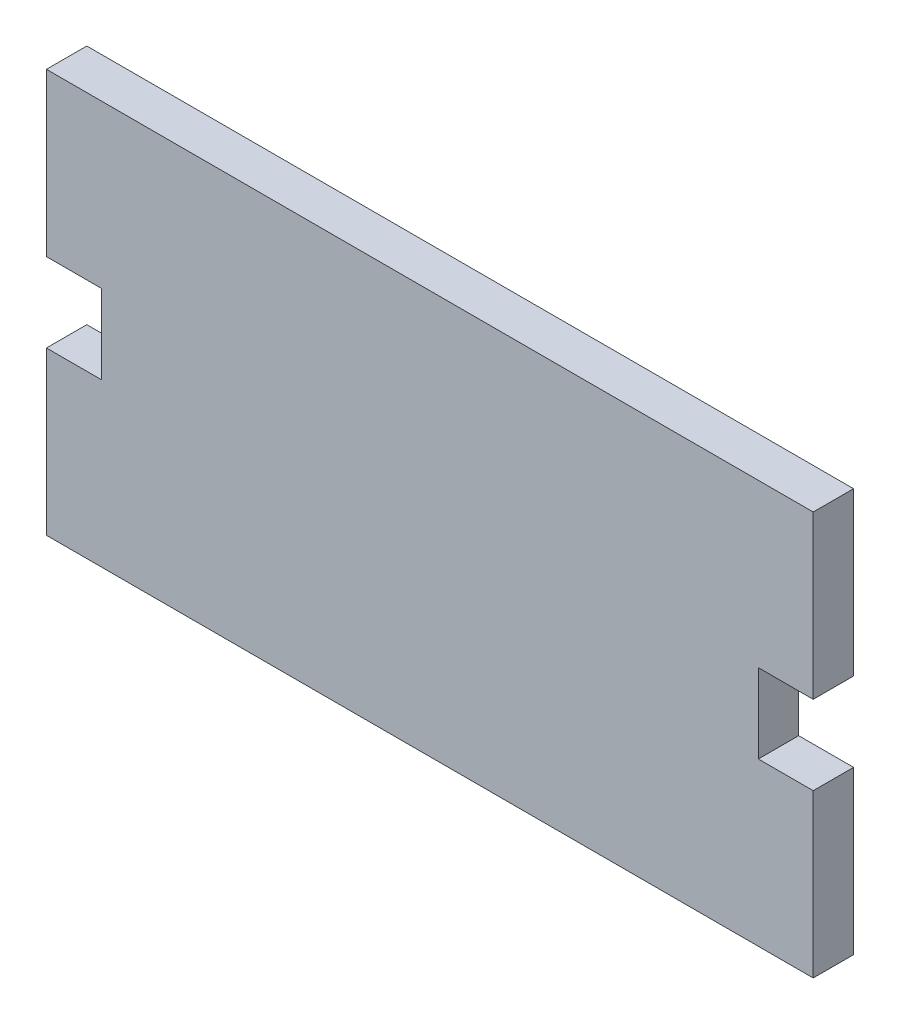
ISO-10303-21;
HEADER;
FILE_DESCRIPTION(('STEP AP214'),'2;1');
FILE_NAME('part.step','',(''),(''),'','','');
FILE_SCHEMA(('AUTOMOTIVE_DESIGN { 1 0 10303 214 1 1 1 1 }'));
ENDSEC;
DATA;
#1=APPLICATION_CONTEXT('core data for automotive mechanical design processes');
#2=APPLICATION_PROTOCOL_DEFINITION('international standard','automotive_design',2000,#1);
#3=PRODUCT_CONTEXT('',#1,'mechanical');
#4=PRODUCT('Part','Part','',(#3));
#5=PRODUCT_RELATED_PRODUCT_CATEGORY('part','',(#4));
#6=PRODUCT_DEFINITION_FORMATION('','',#4);
#7=PRODUCT_DEFINITION_CONTEXT('part definition',#1,'design');
#8=PRODUCT_DEFINITION('design','',#6,#7);
#9=PRODUCT_DEFINITION_SHAPE('','',#8);
#10=(LENGTH_UNIT() NAMED_UNIT(*) SI_UNIT(.MILLI.,.METRE.));
#11=(NAMED_UNIT(*) PLANE_ANGLE_UNIT() SI_UNIT($,.RADIAN.));
#12=(NAMED_UNIT(*) SI_UNIT($,.STERADIAN.) SOLID_ANGLE_UNIT());
#13=UNCERTAINTY_MEASURE_WITH_UNIT(LENGTH_MEASURE(1.E-05),#10,'distance_accuracy_value','');
#14=(GEOMETRIC_REPRESENTATION_CONTEXT(3) GLOBAL_UNCERTAINTY_ASSIGNED_CONTEXT((#13)) GLOBAL_UNIT_ASSIGNED_CONTEXT((#10,
#11,#12)) REPRESENTATION_CONTEXT('',''));
#15=CARTESIAN_POINT('',(0.,0.,0.));
#16=DIRECTION('',(0.,0.,1.));
#17=DIRECTION('',(1.,0.,0.));
#18=AXIS2_PLACEMENT_3D('',#15,#16,#17);
#19=CARTESIAN_POINT('',(0.,0.,6.35));
#20=DIRECTION('',(1.,0.,0.));
#21=DIRECTION('',(0.,0.,-1.));
#22=AXIS2_PLACEMENT_3D('',#19,#20,#21);
#23=PLANE('',#22);
#24=DIRECTION('',(0.,-1.,0.));
#25=VECTOR('',#24,1.);
#26=CARTESIAN_POINT('',(0.,0.,0.));
#27=LINE('',#26,#25);
#28=CARTESIAN_POINT('',(0.,63.5,0.));
#29=VERTEX_POINT('',#28);
#30=CARTESIAN_POINT('',(0.,37.973,0.));
#31=VERTEX_POINT('',#30);
#32=EDGE_CURVE('E147',#29,#31,#27,.T.);
#33=ORIENTED_EDGE('',*,*,#32,.T.);
#34=DIRECTION('',(0.,0.,1.));
#35=VECTOR('',#34,1.);
#36=CARTESIAN_POINT('',(0.,37.973,0.));
#37=LINE('',#36,#35);
#38=CARTESIAN_POINT('',(0.,37.973,6.35));
#39=VERTEX_POINT('',#38);
#40=EDGE_CURVE('E148',#31,#39,#37,.T.);
#41=ORIENTED_EDGE('',*,*,#40,.T.);
#42=DIRECTION('',(0.,-1.,0.));
#43=VECTOR('',#42,1.);
#44=CARTESIAN_POINT('',(0.,0.,6.35));
#45=LINE('',#44,#43);
#46=CARTESIAN_POINT('',(0.,63.5,6.35));
#47=VERTEX_POINT('',#46);
#48=EDGE_CURVE('E197',#47,#39,#45,.T.);
#49=ORIENTED_EDGE('',*,*,#48,.F.);
#50=DIRECTION('',(0.,0.,-1.));
#51=VECTOR('',#50,1.);
#52=CARTESIAN_POINT('',(0.,63.5,6.35));
#53=LINE('',#52,#51);
#54=EDGE_CURVE('E165',#47,#29,#53,.T.);
#55=ORIENTED_EDGE('',*,*,#54,.T.);
#56=EDGE_LOOP('',(#33,#41,#49,#55));
#57=FACE_BOUND('',#56,.T.);
#58=ADVANCED_FACE('F36',(#57),#23,.F.);
#59=CARTESIAN_POINT('',(120.65,0.,6.35));
#60=DIRECTION('',(-1.,0.,0.));
#61=DIRECTION('',(0.,0.,1.));
#62=AXIS2_PLACEMENT_3D('',#59,#60,#61);
#63=PLANE('',#62);
#64=DIRECTION('',(0.,1.,0.));
#65=VECTOR('',#64,1.);
#66=CARTESIAN_POINT('',(120.65,0.,0.));
#67=LINE('',#66,#65);
#68=CARTESIAN_POINT('',(120.65,0.,0.));
#69=VERTEX_POINT('',#68);
#70=CARTESIAN_POINT('',(120.65,25.527,0.));
#71=VERTEX_POINT('',#70);
#72=EDGE_CURVE('E160',#69,#71,#67,.T.);
#73=ORIENTED_EDGE('',*,*,#72,.T.);
#74=DIRECTION('',(0.,0.,1.));
#75=VECTOR('',#74,1.);
#76=CARTESIAN_POINT('',(120.65,25.527,0.));
#77=LINE('',#76,#75);
#78=CARTESIAN_POINT('',(120.65,25.527,6.35));
#79=VERTEX_POINT('',#78);
#80=EDGE_CURVE('E237',#71,#79,#77,.T.);
#81=ORIENTED_EDGE('',*,*,#80,.T.);
#82=DIRECTION('',(0.,1.,0.));
#83=VECTOR('',#82,1.);
#84=CARTESIAN_POINT('',(120.65,0.,6.35));
#85=LINE('',#84,#83);
#86=CARTESIAN_POINT('',(120.65,0.,6.35));
#87=VERTEX_POINT('',#86);
#88=EDGE_CURVE('E177',#87,#79,#85,.T.);
#89=ORIENTED_EDGE('',*,*,#88,.F.);
#90=DIRECTION('',(0.,0.,-1.));
#91=VECTOR('',#90,1.);
#92=CARTESIAN_POINT('',(120.65,0.,6.35));
#93=LINE('',#92,#91);
#94=EDGE_CURVE('E44',#87,#69,#93,.T.);
#95=ORIENTED_EDGE('',*,*,#94,.T.);
#96=EDGE_LOOP('',(#73,#81,#89,#95));
#97=FACE_BOUND('',#96,.T.);
#98=ADVANCED_FACE('F174',(#97),#63,.F.);
#99=CARTESIAN_POINT('',(0.,25.527,6.35));
#100=VERTEX_POINT('',#99);
#101=CARTESIAN_POINT('',(0.,0.,6.35));
#102=VERTEX_POINT('',#101);
#103=EDGE_CURVE('E140',#100,#102,#45,.T.);
#104=ORIENTED_EDGE('',*,*,#103,.F.);
#105=DIRECTION('',(0.,0.,1.));
#106=VECTOR('',#105,1.);
#107=CARTESIAN_POINT('',(0.,25.527,0.));
#108=LINE('',#107,#106);
#109=CARTESIAN_POINT('',(0.,25.527,0.));
#110=VERTEX_POINT('',#109);
#111=EDGE_CURVE('E128',#110,#100,#108,.T.);
#112=ORIENTED_EDGE('',*,*,#111,.F.);
#113=CARTESIAN_POINT('',(0.,0.,0.));
#114=VERTEX_POINT('',#113);
#115=EDGE_CURVE('E138',#110,#114,#27,.T.);
#116=ORIENTED_EDGE('',*,*,#115,.T.);
#117=DIRECTION('',(0.,0.,-1.));
#118=VECTOR('',#117,1.);
#119=CARTESIAN_POINT('',(0.,0.,6.35));
#120=LINE('',#119,#118);
#121=EDGE_CURVE('E11',#102,#114,#120,.T.);
#122=ORIENTED_EDGE('',*,*,#121,.F.);
#123=EDGE_LOOP('',(#104,#112,#116,#122));
#124=FACE_BOUND('',#123,.T.);
#125=ADVANCED_FACE('F38',(#124),#23,.F.);
#126=CARTESIAN_POINT('',(0.,0.,6.35));
#127=DIRECTION('',(0.,1.,0.));
#128=DIRECTION('',(0.,0.,1.));
#129=AXIS2_PLACEMENT_3D('',#126,#127,#128);
#130=PLANE('',#129);
#131=DIRECTION('',(1.,0.,0.));
#132=VECTOR('',#131,1.);
#133=CARTESIAN_POINT('',(0.,0.,0.));
#134=LINE('',#133,#132);
#135=EDGE_CURVE('E146',#114,#69,#134,.T.);
#136=ORIENTED_EDGE('',*,*,#135,.T.);
#137=ORIENTED_EDGE('',*,*,#94,.F.);
#138=DIRECTION('',(1.,0.,0.));
#139=VECTOR('',#138,1.);
#140=CARTESIAN_POINT('',(0.,0.,6.35));
#141=LINE('',#140,#139);
#142=EDGE_CURVE('E200',#102,#87,#141,.T.);
#143=ORIENTED_EDGE('',*,*,#142,.F.);
#144=ORIENTED_EDGE('',*,*,#121,.T.);
#145=EDGE_LOOP('',(#136,#137,#143,#144));
#146=FACE_BOUND('',#145,.T.);
#147=ADVANCED_FACE('F262',(#146),#130,.F.);
#148=CARTESIAN_POINT('',(120.65,37.973,6.35));
#149=VERTEX_POINT('',#148);
#150=CARTESIAN_POINT('',(120.65,63.5,6.35));
#151=VERTEX_POINT('',#150);
#152=EDGE_CURVE('E201',#149,#151,#85,.T.);
#153=ORIENTED_EDGE('',*,*,#152,.F.);
#154=DIRECTION('',(0.,0.,1.));
#155=VECTOR('',#154,1.);
#156=CARTESIAN_POINT('',(120.65,37.973,0.));
#157=LINE('',#156,#155);
#158=CARTESIAN_POINT('',(120.65,37.973,0.));
#159=VERTEX_POINT('',#158);
#160=EDGE_CURVE('E185',#159,#149,#157,.T.);
#161=ORIENTED_EDGE('',*,*,#160,.F.);
#162=CARTESIAN_POINT('',(120.65,63.5,0.));
#163=VERTEX_POINT('',#162);
#164=EDGE_CURVE('E159',#159,#163,#67,.T.);
#165=ORIENTED_EDGE('',*,*,#164,.T.);
#166=DIRECTION('',(0.,0.,-1.));
#167=VECTOR('',#166,1.);
#168=CARTESIAN_POINT('',(120.65,63.5,6.35));
#169=LINE('',#168,#167);
#170=EDGE_CURVE('E168',#151,#163,#169,.T.);
#171=ORIENTED_EDGE('',*,*,#170,.F.);
#172=EDGE_LOOP('',(#153,#161,#165,#171));
#173=FACE_BOUND('',#172,.T.);
#174=ADVANCED_FACE('F214',(#173),#63,.F.);
#175=CARTESIAN_POINT('',(0.,63.5,6.35));
#176=DIRECTION('',(0.,-1.,0.));
#177=DIRECTION('',(0.,0.,-1.));
#178=AXIS2_PLACEMENT_3D('',#175,#176,#177);
#179=PLANE('',#178);
#180=DIRECTION('',(-1.,0.,0.));
#181=VECTOR('',#180,1.);
#182=CARTESIAN_POINT('',(0.,63.5,0.));
#183=LINE('',#182,#181);
#184=EDGE_CURVE('E163',#163,#29,#183,.T.);
#185=ORIENTED_EDGE('',*,*,#184,.T.);
#186=ORIENTED_EDGE('',*,*,#54,.F.);
#187=DIRECTION('',(-1.,0.,0.));
#188=VECTOR('',#187,1.);
#189=CARTESIAN_POINT('',(0.,63.5,6.35));
#190=LINE('',#189,#188);
#191=EDGE_CURVE('E156',#151,#47,#190,.T.);
#192=ORIENTED_EDGE('',*,*,#191,.F.);
#193=ORIENTED_EDGE('',*,*,#170,.T.);
#194=EDGE_LOOP('',(#185,#186,#192,#193));
#195=FACE_BOUND('',#194,.T.);
#196=ADVANCED_FACE('F218',(#195),#179,.F.);
#197=CARTESIAN_POINT('',(0.,0.,6.35));
#198=DIRECTION('',(0.,0.,-1.));
#199=DIRECTION('',(-1.,0.,0.));
#200=AXIS2_PLACEMENT_3D('',#197,#198,#199);
#201=PLANE('',#200);
#202=ORIENTED_EDGE('',*,*,#48,.T.);
#203=DIRECTION('',(-1.,0.,0.));
#204=VECTOR('',#203,1.);
#205=CARTESIAN_POINT('',(0.,37.973,6.35));
#206=LINE('',#205,#204);
#207=CARTESIAN_POINT('',(8.636,37.973,6.35));
#208=VERTEX_POINT('',#207);
#209=EDGE_CURVE('E133',#208,#39,#206,.T.);
#210=ORIENTED_EDGE('',*,*,#209,.F.);
#211=DIRECTION('',(0.,1.,0.));
#212=VECTOR('',#211,1.);
#213=CARTESIAN_POINT('',(8.636,37.973,6.35));
#214=LINE('',#213,#212);
#215=CARTESIAN_POINT('',(8.636,25.527,6.35));
#216=VERTEX_POINT('',#215);
#217=EDGE_CURVE('E225',#216,#208,#214,.T.);
#218=ORIENTED_EDGE('',*,*,#217,.F.);
#219=DIRECTION('',(1.,0.,0.));
#220=VECTOR('',#219,1.);
#221=CARTESIAN_POINT('',(0.,25.527,6.35));
#222=LINE('',#221,#220);
#223=EDGE_CURVE('E228',#100,#216,#222,.T.);
#224=ORIENTED_EDGE('',*,*,#223,.F.);
#225=ORIENTED_EDGE('',*,*,#103,.T.);
#226=ORIENTED_EDGE('',*,*,#142,.T.);
#227=ORIENTED_EDGE('',*,*,#88,.T.);
#228=DIRECTION('',(1.,0.,0.));
#229=VECTOR('',#228,1.);
#230=CARTESIAN_POINT('',(120.65,25.527,6.35));
#231=LINE('',#230,#229);
#232=CARTESIAN_POINT('',(112.014,25.527,6.35));
#233=VERTEX_POINT('',#232);
#234=EDGE_CURVE('E196',#233,#79,#231,.T.);
#235=ORIENTED_EDGE('',*,*,#234,.F.);
#236=DIRECTION('',(0.,-1.,0.));
#237=VECTOR('',#236,1.);
#238=CARTESIAN_POINT('',(112.014,37.973,6.35));
#239=LINE('',#238,#237);
#240=CARTESIAN_POINT('',(112.014,37.973,6.35));
#241=VERTEX_POINT('',#240);
#242=EDGE_CURVE('E239',#241,#233,#239,.T.);
#243=ORIENTED_EDGE('',*,*,#242,.F.);
#244=DIRECTION('',(-1.,0.,0.));
#245=VECTOR('',#244,1.);
#246=CARTESIAN_POINT('',(120.65,37.973,6.35));
#247=LINE('',#246,#245);
#248=EDGE_CURVE('E192',#149,#241,#247,.T.);
#249=ORIENTED_EDGE('',*,*,#248,.F.);
#250=ORIENTED_EDGE('',*,*,#152,.T.);
#251=ORIENTED_EDGE('',*,*,#191,.T.);
#252=EDGE_LOOP('',(#202,#210,#218,#224,#225,#226,#227,#235,#243,#249,#250,#251));
#253=FACE_BOUND('',#252,.T.);
#254=ADVANCED_FACE('F207',(#253),#201,.F.);
#255=CARTESIAN_POINT('',(0.,0.,0.));
#256=DIRECTION('',(0.,0.,-1.));
#257=DIRECTION('',(-1.,0.,0.));
#258=AXIS2_PLACEMENT_3D('',#255,#256,#257);
#259=PLANE('',#258);
#260=DIRECTION('',(-1.,0.,0.));
#261=VECTOR('',#260,1.);
#262=CARTESIAN_POINT('',(0.,37.973,0.));
#263=LINE('',#262,#261);
#264=CARTESIAN_POINT('',(8.636,37.973,0.));
#265=VERTEX_POINT('',#264);
#266=EDGE_CURVE('E141',#265,#31,#263,.T.);
#267=ORIENTED_EDGE('',*,*,#266,.T.);
#268=ORIENTED_EDGE('',*,*,#32,.F.);
#269=ORIENTED_EDGE('',*,*,#184,.F.);
#270=ORIENTED_EDGE('',*,*,#164,.F.);
#271=DIRECTION('',(-1.,0.,0.));
#272=VECTOR('',#271,1.);
#273=CARTESIAN_POINT('',(120.65,37.973,0.));
#274=LINE('',#273,#272);
#275=CARTESIAN_POINT('',(112.014,37.973,0.));
#276=VERTEX_POINT('',#275);
#277=EDGE_CURVE('E187',#159,#276,#274,.T.);
#278=ORIENTED_EDGE('',*,*,#277,.T.);
#279=DIRECTION('',(0.,-1.,0.));
#280=VECTOR('',#279,1.);
#281=CARTESIAN_POINT('',(112.014,37.973,0.));
#282=LINE('',#281,#280);
#283=CARTESIAN_POINT('',(112.014,25.527,0.));
#284=VERTEX_POINT('',#283);
#285=EDGE_CURVE('E59',#276,#284,#282,.T.);
#286=ORIENTED_EDGE('',*,*,#285,.T.);
#287=DIRECTION('',(1.,0.,0.));
#288=VECTOR('',#287,1.);
#289=CARTESIAN_POINT('',(120.65,25.527,0.));
#290=LINE('',#289,#288);
#291=EDGE_CURVE('E182',#284,#71,#290,.T.);
#292=ORIENTED_EDGE('',*,*,#291,.T.);
#293=ORIENTED_EDGE('',*,*,#72,.F.);
#294=ORIENTED_EDGE('',*,*,#135,.F.);
#295=ORIENTED_EDGE('',*,*,#115,.F.);
#296=DIRECTION('',(1.,0.,0.));
#297=VECTOR('',#296,1.);
#298=CARTESIAN_POINT('',(0.,25.527,0.));
#299=LINE('',#298,#297);
#300=CARTESIAN_POINT('',(8.636,25.527,0.));
#301=VERTEX_POINT('',#300);
#302=EDGE_CURVE('E124',#110,#301,#299,.T.);
#303=ORIENTED_EDGE('',*,*,#302,.T.);
#304=DIRECTION('',(0.,1.,0.));
#305=VECTOR('',#304,1.);
#306=CARTESIAN_POINT('',(8.636,37.973,0.));
#307=LINE('',#306,#305);
#308=EDGE_CURVE('E51',#301,#265,#307,.T.);
#309=ORIENTED_EDGE('',*,*,#308,.T.);
#310=EDGE_LOOP('',(#267,#268,#269,#270,#278,#286,#292,#293,#294,#295,#303,#309));
#311=FACE_BOUND('',#310,.T.);
#312=ADVANCED_FACE('F144',(#311),#259,.T.);
#313=CARTESIAN_POINT('',(120.65,25.527,0.));
#314=DIRECTION('',(0.,-1.,0.));
#315=DIRECTION('',(1.,0.,0.));
#316=AXIS2_PLACEMENT_3D('',#313,#314,#315);
#317=PLANE('',#316);
#318=ORIENTED_EDGE('',*,*,#234,.T.);
#319=ORIENTED_EDGE('',*,*,#80,.F.);
#320=ORIENTED_EDGE('',*,*,#291,.F.);
#321=DIRECTION('',(0.,0.,1.));
#322=VECTOR('',#321,1.);
#323=CARTESIAN_POINT('',(112.014,25.527,0.));
#324=LINE('',#323,#322);
#325=EDGE_CURVE('E235',#284,#233,#324,.T.);
#326=ORIENTED_EDGE('',*,*,#325,.T.);
#327=EDGE_LOOP('',(#318,#319,#320,#326));
#328=FACE_BOUND('',#327,.T.);
#329=ADVANCED_FACE('F274',(#328),#317,.F.);
#330=CARTESIAN_POINT('',(112.014,37.973,0.));
#331=DIRECTION('',(-1.,0.,0.));
#332=DIRECTION('',(0.,0.,1.));
#333=AXIS2_PLACEMENT_3D('',#330,#331,#332);
#334=PLANE('',#333);
#335=ORIENTED_EDGE('',*,*,#242,.T.);
#336=ORIENTED_EDGE('',*,*,#325,.F.);
#337=ORIENTED_EDGE('',*,*,#285,.F.);
#338=DIRECTION('',(0.,0.,1.));
#339=VECTOR('',#338,1.);
#340=CARTESIAN_POINT('',(112.014,37.973,0.));
#341=LINE('',#340,#339);
#342=EDGE_CURVE('E189',#276,#241,#341,.T.);
#343=ORIENTED_EDGE('',*,*,#342,.T.);
#344=EDGE_LOOP('',(#335,#336,#337,#343));
#345=FACE_BOUND('',#344,.T.);
#346=ADVANCED_FACE('F279',(#345),#334,.F.);
#347=CARTESIAN_POINT('',(120.65,37.973,0.));
#348=DIRECTION('',(0.,1.,0.));
#349=DIRECTION('',(-1.,0.,0.));
#350=AXIS2_PLACEMENT_3D('',#347,#348,#349);
#351=PLANE('',#350);
#352=ORIENTED_EDGE('',*,*,#248,.T.);
#353=ORIENTED_EDGE('',*,*,#342,.F.);
#354=ORIENTED_EDGE('',*,*,#277,.F.);
#355=ORIENTED_EDGE('',*,*,#160,.T.);
#356=EDGE_LOOP('',(#352,#353,#354,#355));
#357=FACE_BOUND('',#356,.T.);
#358=ADVANCED_FACE('F254',(#357),#351,.F.);
#359=CARTESIAN_POINT('',(0.,37.973,0.));
#360=DIRECTION('',(0.,1.,0.));
#361=DIRECTION('',(-1.,0.,0.));
#362=AXIS2_PLACEMENT_3D('',#359,#360,#361);
#363=PLANE('',#362);
#364=ORIENTED_EDGE('',*,*,#209,.T.);
#365=ORIENTED_EDGE('',*,*,#40,.F.);
#366=ORIENTED_EDGE('',*,*,#266,.F.);
#367=DIRECTION('',(0.,0.,1.));
#368=VECTOR('',#367,1.);
#369=CARTESIAN_POINT('',(8.636,37.973,0.));
#370=LINE('',#369,#368);
#371=EDGE_CURVE('E152',#265,#208,#370,.T.);
#372=ORIENTED_EDGE('',*,*,#371,.T.);
#373=EDGE_LOOP('',(#364,#365,#366,#372));
#374=FACE_BOUND('',#373,.T.);
#375=ADVANCED_FACE('F245',(#374),#363,.F.);
#376=CARTESIAN_POINT('',(8.636,37.973,0.));
#377=DIRECTION('',(1.,0.,0.));
#378=DIRECTION('',(0.,0.,-1.));
#379=AXIS2_PLACEMENT_3D('',#376,#377,#378);
#380=PLANE('',#379);
#381=ORIENTED_EDGE('',*,*,#217,.T.);
#382=ORIENTED_EDGE('',*,*,#371,.F.);
#383=ORIENTED_EDGE('',*,*,#308,.F.);
#384=DIRECTION('',(0.,0.,1.));
#385=VECTOR('',#384,1.);
#386=CARTESIAN_POINT('',(8.636,25.527,0.));
#387=LINE('',#386,#385);
#388=EDGE_CURVE('E130',#301,#216,#387,.T.);
#389=ORIENTED_EDGE('',*,*,#388,.T.);
#390=EDGE_LOOP('',(#381,#382,#383,#389));
#391=FACE_BOUND('',#390,.T.);
#392=ADVANCED_FACE('F246',(#391),#380,.F.);
#393=CARTESIAN_POINT('',(0.,25.527,0.));
#394=DIRECTION('',(0.,-1.,0.));
#395=DIRECTION('',(1.,0.,0.));
#396=AXIS2_PLACEMENT_3D('',#393,#394,#395);
#397=PLANE('',#396);
#398=ORIENTED_EDGE('',*,*,#223,.T.);
#399=ORIENTED_EDGE('',*,*,#388,.F.);
#400=ORIENTED_EDGE('',*,*,#302,.F.);
#401=ORIENTED_EDGE('',*,*,#111,.T.);
#402=EDGE_LOOP('',(#398,#399,#400,#401));
#403=FACE_BOUND('',#402,.T.);
#404=ADVANCED_FACE('F127',(#403),#397,.F.);
#405=CLOSED_SHELL('',(#58,#98,#125,#147,#174,#196,#254,#312,#329,#346,#358,#375,#392,#404));
#406=MANIFOLD_SOLID_BREP('B2',#405);
#407=ADVANCED_BREP_SHAPE_REPRESENTATION('',(#18,#406),#14);
#408=SHAPE_DEFINITION_REPRESENTATION(#9,#407);
ENDSEC;
END-ISO-10303-21;
